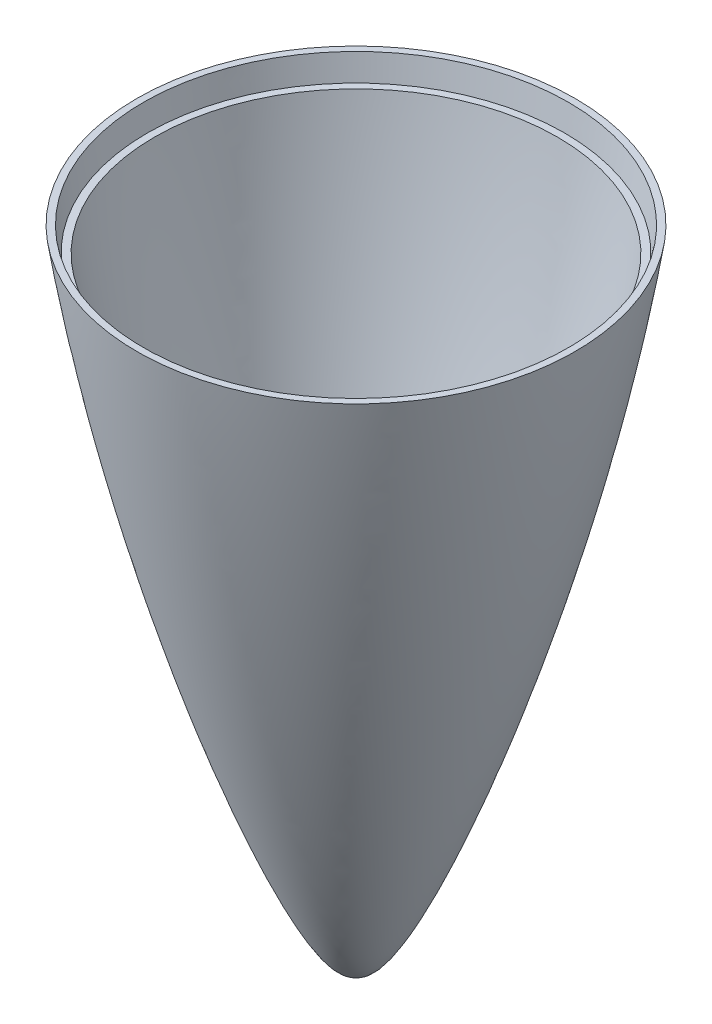
ISO-10303-21;
HEADER;
FILE_DESCRIPTION(('STEP AP214'),'2;1');
FILE_NAME('part.step','',(''),(''),'','','');
FILE_SCHEMA(('AUTOMOTIVE_DESIGN { 1 0 10303 214 1 1 1 1 }'));
ENDSEC;
DATA;
#1=APPLICATION_CONTEXT('core data for automotive mechanical design processes');
#2=APPLICATION_PROTOCOL_DEFINITION('international standard','automotive_design',2000,#1);
#3=PRODUCT_CONTEXT('',#1,'mechanical');
#4=PRODUCT('Part','Part','',(#3));
#5=PRODUCT_RELATED_PRODUCT_CATEGORY('part','',(#4));
#6=PRODUCT_DEFINITION_FORMATION('','',#4);
#7=PRODUCT_DEFINITION_CONTEXT('part definition',#1,'design');
#8=PRODUCT_DEFINITION('design','',#6,#7);
#9=PRODUCT_DEFINITION_SHAPE('','',#8);
#10=(LENGTH_UNIT() NAMED_UNIT(*) SI_UNIT(.MILLI.,.METRE.));
#11=(NAMED_UNIT(*) PLANE_ANGLE_UNIT() SI_UNIT($,.RADIAN.));
#12=(NAMED_UNIT(*) SI_UNIT($,.STERADIAN.) SOLID_ANGLE_UNIT());
#13=UNCERTAINTY_MEASURE_WITH_UNIT(LENGTH_MEASURE(1.E-05),#10,'distance_accuracy_value','');
#14=(GEOMETRIC_REPRESENTATION_CONTEXT(3) GLOBAL_UNCERTAINTY_ASSIGNED_CONTEXT((#13)) GLOBAL_UNIT_ASSIGNED_CONTEXT((#10,
#11,#12)) REPRESENTATION_CONTEXT('',''));
#15=CARTESIAN_POINT('',(0.,0.,0.));
#16=DIRECTION('',(0.,0.,1.));
#17=DIRECTION('',(1.,0.,0.));
#18=AXIS2_PLACEMENT_3D('',#15,#16,#17);
#19=CARTESIAN_POINT('',(-50.,-3.57642238484904,0.));
#20=CARTESIAN_POINT('',(-50.,-87.4146151505988,0.));
#21=CARTESIAN_POINT('',(-8.76053567009529,-197.467282910671,0.));
#22=CARTESIAN_POINT('',(0.,-197.467282910671,0.));
#23=B_SPLINE_CURVE_WITH_KNOTS('',3,(#19,#20,#21,#22),.UNSPECIFIED.,.F.,.F.,(4,4),(0.,1.),.UNSPECIFIED.);
#24=CARTESIAN_POINT('',(0.,-138.349059141026,0.));
#25=DIRECTION('',(0.,-1.,0.));
#26=AXIS1_PLACEMENT('',#24,#25);
#27=SURFACE_OF_REVOLUTION('',#23,#26);
#28=CARTESIAN_POINT('',(0.,-197.467282910671,0.));
#29=VERTEX_POINT('',#28);
#30=VERTEX_LOOP('',#29);
#31=FACE_BOUND('',#30,.T.);
#32=CARTESIAN_POINT('',(0.,-62.6662041070256,0.));
#33=DIRECTION('',(0.,-1.,0.));
#34=DIRECTION('',(0.,0.,-1.));
#35=AXIS2_PLACEMENT_3D('',#32,#33,#34);
#36=CIRCLE('',#35,44.5647800056024);
#37=CARTESIAN_POINT('',(0.,-62.6662041070256,-44.5647800056024));
#38=VERTEX_POINT('',#37);
#39=EDGE_CURVE('E190',#38,#38,#36,.F.);
#40=ORIENTED_EDGE('',*,*,#39,.T.);
#41=EDGE_LOOP('',(#40));
#42=FACE_BOUND('',#41,.T.);
#43=ADVANCED_FACE('F181',(#31,#42),#27,.F.);
#44=CARTESIAN_POINT('',(0.,-57.2247337876669,46.9682378765563));
#45=DIRECTION('',(0.,1.,0.));
#46=DIRECTION('',(0.,0.,1.));
#47=AXIS2_PLACEMENT_3D('',#44,#45,#46);
#48=PLANE('',#47);
#49=CARTESIAN_POINT('',(0.,-57.2247337876669,0.));
#50=DIRECTION('',(0.,-1.,0.));
#51=DIRECTION('',(0.,0.,-1.));
#52=AXIS2_PLACEMENT_3D('',#49,#50,#51);
#53=CIRCLE('',#52,47.0108451286285);
#54=CARTESIAN_POINT('',(0.,-57.2247337876669,-47.0108451286285));
#55=VERTEX_POINT('',#54);
#56=EDGE_CURVE('E232',#55,#55,#53,.T.);
#57=ORIENTED_EDGE('',*,*,#56,.T.);
#58=EDGE_LOOP('',(#57));
#59=FACE_BOUND('',#58,.T.);
#60=CARTESIAN_POINT('',(0.,-57.2247337876669,0.));
#61=DIRECTION('',(0.,-1.,0.));
#62=DIRECTION('',(0.,0.,-1.));
#63=AXIS2_PLACEMENT_3D('',#60,#61,#62);
#64=CIRCLE('',#63,48.4783088576812);
#65=CARTESIAN_POINT('',(0.,-57.2247337876669,-48.4783088576812));
#66=VERTEX_POINT('',#65);
#67=EDGE_CURVE('E13',#66,#66,#64,.F.);
#68=ORIENTED_EDGE('',*,*,#67,.T.);
#69=EDGE_LOOP('',(#68));
#70=FACE_BOUND('',#69,.T.);
#71=ADVANCED_FACE('F201',(#59,#70),#48,.T.);
#72=CARTESIAN_POINT('',(0.,-62.6662041070256,41.2833305331219));
#73=DIRECTION('',(0.,1.,0.));
#74=DIRECTION('',(0.,0.,1.));
#75=AXIS2_PLACEMENT_3D('',#72,#73,#74);
#76=PLANE('',#75);
#77=ORIENTED_EDGE('',*,*,#39,.F.);
#78=EDGE_LOOP('',(#77));
#79=FACE_BOUND('',#78,.T.);
#80=CARTESIAN_POINT('',(0.,-62.6662041070256,0.));
#81=DIRECTION('',(0.,-1.,0.));
#82=DIRECTION('',(0.,0.,-1.));
#83=AXIS2_PLACEMENT_3D('',#80,#81,#82);
#84=CIRCLE('',#83,46.136498509834);
#85=CARTESIAN_POINT('',(0.,-62.6662041070256,-46.136498509834));
#86=VERTEX_POINT('',#85);
#87=EDGE_CURVE('E228',#86,#86,#84,.T.);
#88=ORIENTED_EDGE('',*,*,#87,.F.);
#89=EDGE_LOOP('',(#88));
#90=FACE_BOUND('',#89,.T.);
#91=ADVANCED_FACE('F203',(#79,#90),#76,.T.);
#92=CARTESIAN_POINT('',(0.,-57.2247337876669,0.));
#93=DIRECTION('',(0.,1.,0.));
#94=DIRECTION('',(0.,0.,1.));
#95=AXIS2_PLACEMENT_3D('',#92,#93,#94);
#96=CONICAL_SURFACE('',#95,47.0108451286285,0.159320218990424);
#97=ORIENTED_EDGE('',*,*,#87,.T.);
#98=EDGE_LOOP('',(#97));
#99=FACE_BOUND('',#98,.T.);
#100=ORIENTED_EDGE('',*,*,#56,.F.);
#101=EDGE_LOOP('',(#100));
#102=FACE_BOUND('',#101,.T.);
#103=ADVANCED_FACE('F198',(#99,#102),#96,.F.);
#104=CARTESIAN_POINT('',(-53.,-3.57642238484904,0.));
#105=CARTESIAN_POINT('',(-53.,-14.179169862297,0.));
#106=CARTESIAN_POINT('',(-52.3486001173388,-25.1685778416512,0.));
#107=CARTESIAN_POINT('',(-50.0411234391104,-47.407452845757,0.));
#108=CARTESIAN_POINT('',(-48.3848052556148,-58.6567808677515,0.));
#109=CARTESIAN_POINT('',(-42.34472398717,-92.0133662012729,0.));
#110=CARTESIAN_POINT('',(-36.8904398112465,-113.72916339535,0.));
#111=CARTESIAN_POINT('',(-28.292579487771,-142.370979977891,0.));
#112=CARTESIAN_POINT('',(-25.3571238576436,-151.262642337774,0.));
#113=CARTESIAN_POINT('',(-19.6302910279584,-167.214287357821,0.));
#114=CARTESIAN_POINT('',(-16.8398108800146,-174.272990662286,0.));
#115=CARTESIAN_POINT('',(-12.9638753604275,-183.112881208514,0.));
#116=CARTESIAN_POINT('',(-11.7235333921522,-185.768244856211,0.));
#117=CARTESIAN_POINT('',(-9.37136616657032,-190.444654172988,0.));
#118=CARTESIAN_POINT('',(-8.2612571882994,-192.464363780406,0.));
#119=CARTESIAN_POINT('',(-6.69008927737807,-195.000061593951,0.));
#120=CARTESIAN_POINT('',(-6.18192215326002,-195.763251208413,0.));
#121=CARTESIAN_POINT('',(-5.18169947815267,-197.132140736253,0.));
#122=CARTESIAN_POINT('',(-4.69143940886519,-197.737675186474,0.));
#123=CARTESIAN_POINT('',(-3.92837661442751,-198.542862701324,0.));
#124=CARTESIAN_POINT('',(-3.66901826209659,-198.794293636468,0.));
#125=CARTESIAN_POINT('',(-3.12116554291381,-199.265665770596,0.));
#126=CARTESIAN_POINT('',(-2.83296713997371,-199.486138040867,0.));
#127=CARTESIAN_POINT('',(-2.19114811328238,-199.89003955009,0.));
#128=CARTESIAN_POINT('',(-1.83669654532453,-200.075143162485,0.));
#129=CARTESIAN_POINT('',(-1.21587613469278,-200.291841835183,0.));
#130=CARTESIAN_POINT('',(-0.993935535292413,-200.353366943557,0.));
#131=CARTESIAN_POINT('',(-0.518480867402914,-200.441197986513,0.));
#132=CARTESIAN_POINT('',(-0.264727962212751,-200.467282910671,0.));
#133=CARTESIAN_POINT('',(0.,-200.467282910671,0.));
#134=B_SPLINE_CURVE_WITH_KNOTS('',3,(#104,#105,#106,#107,#108,#109,#110,#111,#112,#113,#114,
#115,#116,#117,#118,#119,#120,#121,#122,#123,#124,#125,#126,#127,#128,#129,#130,#131,#132,#133),
.UNSPECIFIED.,.F.,.F.,(4,2,2,2,2,2,2,2,2,2,2,2,2,2,4),(0.,0.125,0.25,0.5,0.625,0.75,
0.812500000000001,0.875000000000001,0.906250000000001,0.937500000000001,0.953125000000001,
0.96875,0.984375,0.9921875,1.),.UNSPECIFIED.);
#135=CARTESIAN_POINT('',(0.,-138.349059141026,0.));
#136=DIRECTION('',(0.,-1.,0.));
#137=AXIS1_PLACEMENT('',#135,#136);
#138=SURFACE_OF_REVOLUTION('',#134,#137);
#139=CARTESIAN_POINT('',(0.,-200.467282910671,0.));
#140=VERTEX_POINT('',#139);
#141=VERTEX_LOOP('',#140);
#142=FACE_BOUND('',#141,.T.);
#143=ORIENTED_EDGE('',*,*,#67,.F.);
#144=EDGE_LOOP('',(#143));
#145=FACE_BOUND('',#144,.T.);
#146=ADVANCED_FACE('F195',(#142,#145),#138,.T.);
#147=CLOSED_SHELL('',(#43,#71,#91,#103,#146));
#148=MANIFOLD_SOLID_BREP('B2',#147);
#149=ADVANCED_BREP_SHAPE_REPRESENTATION('',(#18,#148),#14);
#150=SHAPE_DEFINITION_REPRESENTATION(#9,#149);
ENDSEC;
END-ISO-10303-21;
